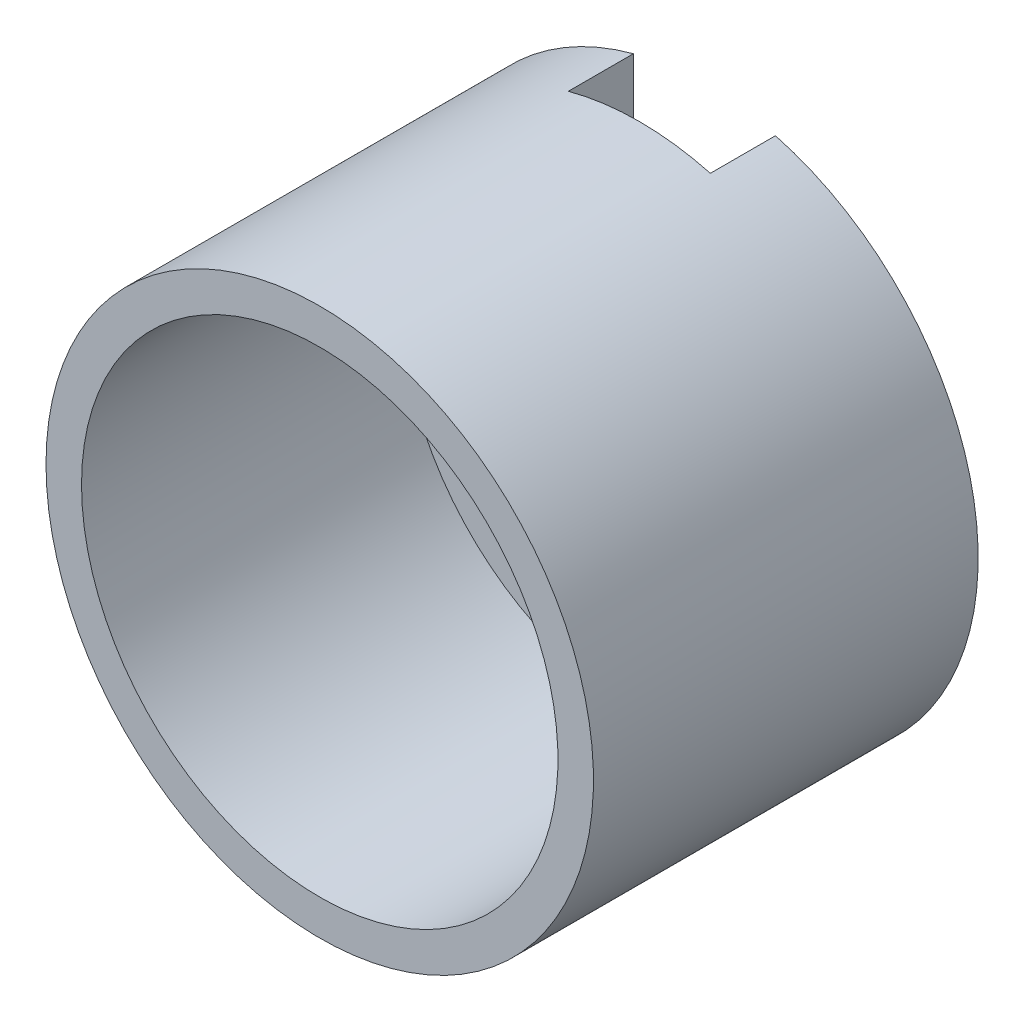
ISO-10303-21;
HEADER;
FILE_DESCRIPTION(('STEP AP214'),'2;1');
FILE_NAME('part.step','',(''),(''),'','','');
FILE_SCHEMA(('AUTOMOTIVE_DESIGN { 1 0 10303 214 1 1 1 1 }'));
ENDSEC;
DATA;
#1=APPLICATION_CONTEXT('core data for automotive mechanical design processes');
#2=APPLICATION_PROTOCOL_DEFINITION('international standard','automotive_design',2000,#1);
#3=PRODUCT_CONTEXT('',#1,'mechanical');
#4=PRODUCT('Part','Part','',(#3));
#5=PRODUCT_RELATED_PRODUCT_CATEGORY('part','',(#4));
#6=PRODUCT_DEFINITION_FORMATION('','',#4);
#7=PRODUCT_DEFINITION_CONTEXT('part definition',#1,'design');
#8=PRODUCT_DEFINITION('design','',#6,#7);
#9=PRODUCT_DEFINITION_SHAPE('','',#8);
#10=(LENGTH_UNIT() NAMED_UNIT(*) SI_UNIT(.MILLI.,.METRE.));
#11=(NAMED_UNIT(*) PLANE_ANGLE_UNIT() SI_UNIT($,.RADIAN.));
#12=(NAMED_UNIT(*) SI_UNIT($,.STERADIAN.) SOLID_ANGLE_UNIT());
#13=UNCERTAINTY_MEASURE_WITH_UNIT(LENGTH_MEASURE(1.E-05),#10,'distance_accuracy_value','');
#14=(GEOMETRIC_REPRESENTATION_CONTEXT(3) GLOBAL_UNCERTAINTY_ASSIGNED_CONTEXT((#13)) GLOBAL_UNIT_ASSIGNED_CONTEXT((#10,
#11,#12)) REPRESENTATION_CONTEXT('',''));
#15=CARTESIAN_POINT('',(0.,0.,0.));
#16=DIRECTION('',(0.,0.,1.));
#17=DIRECTION('',(1.,0.,0.));
#18=AXIS2_PLACEMENT_3D('',#15,#16,#17);
#19=CARTESIAN_POINT('',(0.,0.,2.2));
#20=DIRECTION('',(0.,0.,-1.));
#21=DIRECTION('',(-1.,0.,0.));
#22=AXIS2_PLACEMENT_3D('',#19,#20,#21);
#23=CYLINDRICAL_SURFACE('',#22,3.9);
#24=DIRECTION('',(0.,0.,-1.));
#25=VECTOR('',#24,1.);
#26=CARTESIAN_POINT('',(2.4,-3.074085229788,2.2));
#27=LINE('',#26,#25);
#28=CARTESIAN_POINT('',(2.4,-3.074085229788,2.2));
#29=VERTEX_POINT('',#28);
#30=CARTESIAN_POINT('',(2.4,-3.074085229788,0.));
#31=VERTEX_POINT('',#30);
#32=EDGE_CURVE('E122',#29,#31,#27,.T.);
#33=ORIENTED_EDGE('',*,*,#32,.F.);
#34=CARTESIAN_POINT('',(0.,0.,2.2));
#35=DIRECTION('',(0.,0.,1.));
#36=DIRECTION('',(-1.,0.,0.));
#37=AXIS2_PLACEMENT_3D('',#34,#35,#36);
#38=CIRCLE('',#37,3.9);
#39=CARTESIAN_POINT('',(2.4,3.074085229788,2.2));
#40=VERTEX_POINT('',#39);
#41=EDGE_CURVE('E11',#29,#40,#38,.T.);
#42=ORIENTED_EDGE('',*,*,#41,.T.);
#43=DIRECTION('',(0.,0.,-1.));
#44=VECTOR('',#43,1.);
#45=CARTESIAN_POINT('',(2.4,3.074085229788,2.2));
#46=LINE('',#45,#44);
#47=CARTESIAN_POINT('',(2.4,3.074085229788,0.));
#48=VERTEX_POINT('',#47);
#49=EDGE_CURVE('E140',#40,#48,#46,.T.);
#50=ORIENTED_EDGE('',*,*,#49,.T.);
#51=CARTESIAN_POINT('',(0.,0.,0.));
#52=DIRECTION('',(0.,0.,1.));
#53=DIRECTION('',(-1.,0.,0.));
#54=AXIS2_PLACEMENT_3D('',#51,#52,#53);
#55=CIRCLE('',#54,3.9);
#56=EDGE_CURVE('E134',#31,#48,#55,.T.);
#57=ORIENTED_EDGE('',*,*,#56,.F.);
#58=EDGE_LOOP('',(#33,#42,#50,#57));
#59=FACE_BOUND('',#58,.T.);
#60=ADVANCED_FACE('F17',(#59),#23,.F.);
#61=CARTESIAN_POINT('',(0.,0.,2.2));
#62=DIRECTION('',(0.,0.,1.));
#63=DIRECTION('',(0.,-1.,0.));
#64=AXIS2_PLACEMENT_3D('',#61,#62,#63);
#65=PLANE('',#64);
#66=DIRECTION('',(0.,1.,0.));
#67=VECTOR('',#66,1.);
#68=CARTESIAN_POINT('',(2.4,-10.,2.2));
#69=LINE('',#68,#67);
#70=CARTESIAN_POINT('',(2.4,-7.683911764199,2.2));
#71=VERTEX_POINT('',#70);
#72=EDGE_CURVE('E127',#71,#29,#69,.T.);
#73=ORIENTED_EDGE('',*,*,#72,.F.);
#74=CARTESIAN_POINT('',(0.,0.,2.2));
#75=DIRECTION('',(0.,0.,1.));
#76=DIRECTION('',(-1.,0.,0.));
#77=AXIS2_PLACEMENT_3D('',#74,#75,#76);
#78=CIRCLE('',#77,8.05);
#79=CARTESIAN_POINT('',(2.4,7.683911764199,2.2));
#80=VERTEX_POINT('',#79);
#81=EDGE_CURVE('E27',#71,#80,#78,.T.);
#82=ORIENTED_EDGE('',*,*,#81,.T.);
#83=DIRECTION('',(0.,1.,0.));
#84=VECTOR('',#83,1.);
#85=CARTESIAN_POINT('',(2.4,-10.,2.2));
#86=LINE('',#85,#84);
#87=EDGE_CURVE('E146',#40,#80,#86,.T.);
#88=ORIENTED_EDGE('',*,*,#87,.F.);
#89=ORIENTED_EDGE('',*,*,#41,.F.);
#90=EDGE_LOOP('',(#73,#82,#88,#89));
#91=FACE_BOUND('',#90,.T.);
#92=ADVANCED_FACE('F359',(#91),#65,.T.);
#93=CARTESIAN_POINT('',(0.,0.,13.));
#94=DIRECTION('',(0.,0.,-1.));
#95=DIRECTION('',(-1.,0.,0.));
#96=AXIS2_PLACEMENT_3D('',#93,#94,#95);
#97=CYLINDRICAL_SURFACE('',#96,8.05);
#98=DIRECTION('',(0.,0.,-1.));
#99=VECTOR('',#98,1.);
#100=CARTESIAN_POINT('',(-8.05,0.,13.));
#101=LINE('',#100,#99);
#102=CARTESIAN_POINT('',(-8.05,0.,13.));
#103=VERTEX_POINT('',#102);
#104=CARTESIAN_POINT('',(-8.05,0.,2.2));
#105=VERTEX_POINT('',#104);
#106=EDGE_CURVE('E158',#103,#105,#101,.T.);
#107=ORIENTED_EDGE('',*,*,#106,.F.);
#108=CARTESIAN_POINT('',(0.,0.,13.));
#109=DIRECTION('',(0.,0.,1.));
#110=DIRECTION('',(-1.,0.,0.));
#111=AXIS2_PLACEMENT_3D('',#108,#109,#110);
#112=CIRCLE('',#111,8.05);
#113=EDGE_CURVE('E210',#103,#103,#112,.T.);
#114=ORIENTED_EDGE('',*,*,#113,.T.);
#115=ORIENTED_EDGE('',*,*,#106,.T.);
#116=CARTESIAN_POINT('',(0.,0.,2.2));
#117=DIRECTION('',(0.,0.,1.));
#118=DIRECTION('',(-1.,0.,0.));
#119=AXIS2_PLACEMENT_3D('',#116,#117,#118);
#120=CIRCLE('',#119,8.05);
#121=CARTESIAN_POINT('',(-2.4,7.683911764199,2.2));
#122=VERTEX_POINT('',#121);
#123=EDGE_CURVE('E194',#122,#105,#120,.T.);
#124=ORIENTED_EDGE('',*,*,#123,.F.);
#125=CARTESIAN_POINT('',(0.,0.,2.2));
#126=DIRECTION('',(0.,0.,1.));
#127=DIRECTION('',(-1.,0.,0.));
#128=AXIS2_PLACEMENT_3D('',#125,#126,#127);
#129=CIRCLE('',#128,8.05);
#130=EDGE_CURVE('E204',#80,#122,#129,.T.);
#131=ORIENTED_EDGE('',*,*,#130,.F.);
#132=ORIENTED_EDGE('',*,*,#81,.F.);
#133=CARTESIAN_POINT('',(0.,0.,2.2));
#134=DIRECTION('',(0.,0.,1.));
#135=DIRECTION('',(-1.,0.,0.));
#136=AXIS2_PLACEMENT_3D('',#133,#134,#135);
#137=CIRCLE('',#136,8.05);
#138=CARTESIAN_POINT('',(-2.4,-7.683911764199,2.2));
#139=VERTEX_POINT('',#138);
#140=EDGE_CURVE('E135',#139,#71,#137,.T.);
#141=ORIENTED_EDGE('',*,*,#140,.F.);
#142=CARTESIAN_POINT('',(0.,0.,2.2));
#143=DIRECTION('',(0.,0.,1.));
#144=DIRECTION('',(-1.,0.,0.));
#145=AXIS2_PLACEMENT_3D('',#142,#143,#144);
#146=CIRCLE('',#145,8.05);
#147=EDGE_CURVE('E197',#105,#139,#146,.T.);
#148=ORIENTED_EDGE('',*,*,#147,.F.);
#149=EDGE_LOOP('',(#107,#114,#115,#124,#131,#132,#141,#148));
#150=FACE_BOUND('',#149,.T.);
#151=ADVANCED_FACE('F361',(#150),#97,.F.);
#152=CARTESIAN_POINT('',(0.,0.,2.2));
#153=DIRECTION('',(0.,0.,1.));
#154=DIRECTION('',(0.,-1.,0.));
#155=AXIS2_PLACEMENT_3D('',#152,#153,#154);
#156=PLANE('',#155);
#157=DIRECTION('',(0.,1.,0.));
#158=VECTOR('',#157,1.);
#159=CARTESIAN_POINT('',(2.4,-10.,2.2));
#160=LINE('',#159,#158);
#161=CARTESIAN_POINT('',(2.4,-8.933224501825,2.2));
#162=VERTEX_POINT('',#161);
#163=EDGE_CURVE('E143',#162,#71,#160,.T.);
#164=ORIENTED_EDGE('',*,*,#163,.F.);
#165=CARTESIAN_POINT('',(0.,0.,2.2));
#166=DIRECTION('',(0.,0.,1.));
#167=DIRECTION('',(-1.,0.,0.));
#168=AXIS2_PLACEMENT_3D('',#165,#166,#167);
#169=CIRCLE('',#168,9.25);
#170=CARTESIAN_POINT('',(-2.4,-8.933224501825,2.2));
#171=VERTEX_POINT('',#170);
#172=EDGE_CURVE('E244',#171,#162,#169,.T.);
#173=ORIENTED_EDGE('',*,*,#172,.F.);
#174=DIRECTION('',(0.,-1.,0.));
#175=VECTOR('',#174,1.);
#176=CARTESIAN_POINT('',(-2.4,10.,2.2));
#177=LINE('',#176,#175);
#178=EDGE_CURVE('E190',#139,#171,#177,.T.);
#179=ORIENTED_EDGE('',*,*,#178,.F.);
#180=ORIENTED_EDGE('',*,*,#140,.T.);
#181=EDGE_LOOP('',(#164,#173,#179,#180));
#182=FACE_BOUND('',#181,.T.);
#183=ADVANCED_FACE('F366',(#182),#156,.F.);
#184=CARTESIAN_POINT('',(2.4,-10.,0.));
#185=DIRECTION('',(-1.,0.,0.));
#186=DIRECTION('',(0.,0.,1.));
#187=AXIS2_PLACEMENT_3D('',#184,#185,#186);
#188=PLANE('',#187);
#189=DIRECTION('',(0.,1.,0.));
#190=VECTOR('',#189,1.);
#191=CARTESIAN_POINT('',(2.4,-10.,0.));
#192=LINE('',#191,#190);
#193=CARTESIAN_POINT('',(2.4,-8.933224501825,0.));
#194=VERTEX_POINT('',#193);
#195=EDGE_CURVE('E130',#194,#31,#192,.T.);
#196=ORIENTED_EDGE('',*,*,#195,.F.);
#197=DIRECTION('',(0.,0.,1.));
#198=VECTOR('',#197,1.);
#199=CARTESIAN_POINT('',(2.4,-8.933224501825,0.));
#200=LINE('',#199,#198);
#201=EDGE_CURVE('E239',#194,#162,#200,.T.);
#202=ORIENTED_EDGE('',*,*,#201,.T.);
#203=ORIENTED_EDGE('',*,*,#163,.T.);
#204=ORIENTED_EDGE('',*,*,#72,.T.);
#205=ORIENTED_EDGE('',*,*,#32,.T.);
#206=EDGE_LOOP('',(#196,#202,#203,#204,#205));
#207=FACE_BOUND('',#206,.T.);
#208=ADVANCED_FACE('F124',(#207),#188,.T.);
#209=CARTESIAN_POINT('',(0.,0.,0.));
#210=DIRECTION('',(0.,0.,1.));
#211=DIRECTION('',(0.,-1.,0.));
#212=AXIS2_PLACEMENT_3D('',#209,#210,#211);
#213=PLANE('',#212);
#214=ORIENTED_EDGE('',*,*,#195,.T.);
#215=ORIENTED_EDGE('',*,*,#56,.T.);
#216=DIRECTION('',(0.,1.,0.));
#217=VECTOR('',#216,1.);
#218=CARTESIAN_POINT('',(2.4,-10.,0.));
#219=LINE('',#218,#217);
#220=CARTESIAN_POINT('',(2.4,8.933224501825,0.));
#221=VERTEX_POINT('',#220);
#222=EDGE_CURVE('E209',#48,#221,#219,.T.);
#223=ORIENTED_EDGE('',*,*,#222,.T.);
#224=CARTESIAN_POINT('',(0.,0.,0.));
#225=DIRECTION('',(0.,0.,1.));
#226=DIRECTION('',(-1.,0.,0.));
#227=AXIS2_PLACEMENT_3D('',#224,#225,#226);
#228=CIRCLE('',#227,9.25);
#229=EDGE_CURVE('E144',#194,#221,#228,.T.);
#230=ORIENTED_EDGE('',*,*,#229,.F.);
#231=EDGE_LOOP('',(#214,#215,#223,#230));
#232=FACE_BOUND('',#231,.T.);
#233=ADVANCED_FACE('F141',(#232),#213,.F.);
#234=CARTESIAN_POINT('',(2.4,-10.,0.));
#235=DIRECTION('',(-1.,0.,0.));
#236=DIRECTION('',(0.,0.,1.));
#237=AXIS2_PLACEMENT_3D('',#234,#235,#236);
#238=PLANE('',#237);
#239=ORIENTED_EDGE('',*,*,#222,.F.);
#240=ORIENTED_EDGE('',*,*,#49,.F.);
#241=ORIENTED_EDGE('',*,*,#87,.T.);
#242=DIRECTION('',(0.,1.,0.));
#243=VECTOR('',#242,1.);
#244=CARTESIAN_POINT('',(2.4,-10.,2.2));
#245=LINE('',#244,#243);
#246=CARTESIAN_POINT('',(2.4,8.933224501825,2.2));
#247=VERTEX_POINT('',#246);
#248=EDGE_CURVE('E203',#80,#247,#245,.T.);
#249=ORIENTED_EDGE('',*,*,#248,.T.);
#250=DIRECTION('',(0.,0.,1.));
#251=VECTOR('',#250,1.);
#252=CARTESIAN_POINT('',(2.4,8.933224501825,0.));
#253=LINE('',#252,#251);
#254=EDGE_CURVE('E232',#221,#247,#253,.T.);
#255=ORIENTED_EDGE('',*,*,#254,.F.);
#256=EDGE_LOOP('',(#239,#240,#241,#249,#255));
#257=FACE_BOUND('',#256,.T.);
#258=ADVANCED_FACE('F235',(#257),#238,.T.);
#259=CARTESIAN_POINT('',(0.,0.,13.));
#260=DIRECTION('',(0.,0.,1.));
#261=DIRECTION('',(0.,-1.,0.));
#262=AXIS2_PLACEMENT_3D('',#259,#260,#261);
#263=PLANE('',#262);
#264=ORIENTED_EDGE('',*,*,#113,.F.);
#265=EDGE_LOOP('',(#264));
#266=FACE_BOUND('',#265,.T.);
#267=CARTESIAN_POINT('',(0.,0.,13.));
#268=DIRECTION('',(0.,0.,1.));
#269=DIRECTION('',(-1.,0.,0.));
#270=AXIS2_PLACEMENT_3D('',#267,#268,#269);
#271=CIRCLE('',#270,9.25);
#272=CARTESIAN_POINT('',(-9.25,0.,13.));
#273=VERTEX_POINT('',#272);
#274=EDGE_CURVE('E177',#273,#273,#271,.T.);
#275=ORIENTED_EDGE('',*,*,#274,.T.);
#276=EDGE_LOOP('',(#275));
#277=FACE_BOUND('',#276,.T.);
#278=ADVANCED_FACE('F331',(#266,#277),#263,.T.);
#279=CARTESIAN_POINT('',(0.,0.,2.2));
#280=DIRECTION('',(0.,0.,1.));
#281=DIRECTION('',(0.,-1.,0.));
#282=AXIS2_PLACEMENT_3D('',#279,#280,#281);
#283=PLANE('',#282);
#284=CARTESIAN_POINT('',(0.,0.,2.2));
#285=DIRECTION('',(0.,0.,1.));
#286=DIRECTION('',(-1.,0.,0.));
#287=AXIS2_PLACEMENT_3D('',#284,#285,#286);
#288=CIRCLE('',#287,9.25);
#289=CARTESIAN_POINT('',(-2.4,8.933224501825,2.2));
#290=VERTEX_POINT('',#289);
#291=EDGE_CURVE('E173',#247,#290,#288,.T.);
#292=ORIENTED_EDGE('',*,*,#291,.F.);
#293=ORIENTED_EDGE('',*,*,#248,.F.);
#294=ORIENTED_EDGE('',*,*,#130,.T.);
#295=DIRECTION('',(0.,-1.,0.));
#296=VECTOR('',#295,1.);
#297=CARTESIAN_POINT('',(-2.4,10.,2.2));
#298=LINE('',#297,#296);
#299=EDGE_CURVE('E261',#290,#122,#298,.T.);
#300=ORIENTED_EDGE('',*,*,#299,.F.);
#301=EDGE_LOOP('',(#292,#293,#294,#300));
#302=FACE_BOUND('',#301,.T.);
#303=ADVANCED_FACE('F353',(#302),#283,.F.);
#304=CARTESIAN_POINT('',(0.,0.,2.2));
#305=DIRECTION('',(0.,0.,1.));
#306=DIRECTION('',(0.,-1.,0.));
#307=AXIS2_PLACEMENT_3D('',#304,#305,#306);
#308=PLANE('',#307);
#309=ORIENTED_EDGE('',*,*,#123,.T.);
#310=ORIENTED_EDGE('',*,*,#147,.T.);
#311=DIRECTION('',(0.,-1.,0.));
#312=VECTOR('',#311,1.);
#313=CARTESIAN_POINT('',(-2.4,10.,2.2));
#314=LINE('',#313,#312);
#315=CARTESIAN_POINT('',(-2.4,-3.074085229788,2.2));
#316=VERTEX_POINT('',#315);
#317=EDGE_CURVE('E183',#316,#139,#314,.T.);
#318=ORIENTED_EDGE('',*,*,#317,.F.);
#319=CARTESIAN_POINT('',(0.,0.,2.2));
#320=DIRECTION('',(0.,0.,1.));
#321=DIRECTION('',(-1.,0.,0.));
#322=AXIS2_PLACEMENT_3D('',#319,#320,#321);
#323=CIRCLE('',#322,3.9);
#324=CARTESIAN_POINT('',(-3.9,0.,2.2));
#325=VERTEX_POINT('',#324);
#326=EDGE_CURVE('E189',#325,#316,#323,.T.);
#327=ORIENTED_EDGE('',*,*,#326,.F.);
#328=CARTESIAN_POINT('',(0.,0.,2.2));
#329=DIRECTION('',(0.,0.,1.));
#330=DIRECTION('',(-1.,0.,0.));
#331=AXIS2_PLACEMENT_3D('',#328,#329,#330);
#332=CIRCLE('',#331,3.9);
#333=CARTESIAN_POINT('',(-2.4,3.074085229788,2.2));
#334=VERTEX_POINT('',#333);
#335=EDGE_CURVE('E267',#334,#325,#332,.T.);
#336=ORIENTED_EDGE('',*,*,#335,.F.);
#337=DIRECTION('',(0.,-1.,0.));
#338=VECTOR('',#337,1.);
#339=CARTESIAN_POINT('',(-2.4,10.,2.2));
#340=LINE('',#339,#338);
#341=EDGE_CURVE('E258',#122,#334,#340,.T.);
#342=ORIENTED_EDGE('',*,*,#341,.F.);
#343=EDGE_LOOP('',(#309,#310,#318,#327,#336,#342));
#344=FACE_BOUND('',#343,.T.);
#345=ADVANCED_FACE('F345',(#344),#308,.T.);
#346=CARTESIAN_POINT('',(0.,0.,2.2));
#347=DIRECTION('',(0.,0.,-1.));
#348=DIRECTION('',(-1.,0.,0.));
#349=AXIS2_PLACEMENT_3D('',#346,#347,#348);
#350=CYLINDRICAL_SURFACE('',#349,3.9);
#351=DIRECTION('',(0.,0.,-1.));
#352=VECTOR('',#351,1.);
#353=CARTESIAN_POINT('',(-3.9,0.,2.2));
#354=LINE('',#353,#352);
#355=CARTESIAN_POINT('',(-3.9,0.,0.));
#356=VERTEX_POINT('',#355);
#357=EDGE_CURVE('E266',#325,#356,#354,.T.);
#358=ORIENTED_EDGE('',*,*,#357,.F.);
#359=ORIENTED_EDGE('',*,*,#326,.T.);
#360=DIRECTION('',(0.,0.,-1.));
#361=VECTOR('',#360,1.);
#362=CARTESIAN_POINT('',(-2.4,-3.074085229788,2.2));
#363=LINE('',#362,#361);
#364=CARTESIAN_POINT('',(-2.4,-3.074085229788,0.));
#365=VERTEX_POINT('',#364);
#366=EDGE_CURVE('E176',#316,#365,#363,.T.);
#367=ORIENTED_EDGE('',*,*,#366,.T.);
#368=CARTESIAN_POINT('',(0.,0.,0.));
#369=DIRECTION('',(0.,0.,1.));
#370=DIRECTION('',(-1.,0.,0.));
#371=AXIS2_PLACEMENT_3D('',#368,#369,#370);
#372=CIRCLE('',#371,3.9);
#373=EDGE_CURVE('E293',#356,#365,#372,.T.);
#374=ORIENTED_EDGE('',*,*,#373,.F.);
#375=EDGE_LOOP('',(#358,#359,#367,#374));
#376=FACE_BOUND('',#375,.T.);
#377=ADVANCED_FACE('F341',(#376),#350,.F.);
#378=CARTESIAN_POINT('',(-2.4,10.,0.));
#379=DIRECTION('',(1.,0.,0.));
#380=DIRECTION('',(0.,1.,0.));
#381=AXIS2_PLACEMENT_3D('',#378,#379,#380);
#382=PLANE('',#381);
#383=DIRECTION('',(0.,-1.,0.));
#384=VECTOR('',#383,1.);
#385=CARTESIAN_POINT('',(-2.4,10.,0.));
#386=LINE('',#385,#384);
#387=CARTESIAN_POINT('',(-2.4,-8.933224501825,0.));
#388=VERTEX_POINT('',#387);
#389=EDGE_CURVE('E286',#365,#388,#386,.T.);
#390=ORIENTED_EDGE('',*,*,#389,.F.);
#391=ORIENTED_EDGE('',*,*,#366,.F.);
#392=ORIENTED_EDGE('',*,*,#317,.T.);
#393=ORIENTED_EDGE('',*,*,#178,.T.);
#394=DIRECTION('',(0.,0.,1.));
#395=VECTOR('',#394,1.);
#396=CARTESIAN_POINT('',(-2.4,-8.933224501825,0.));
#397=LINE('',#396,#395);
#398=EDGE_CURVE('E249',#388,#171,#397,.T.);
#399=ORIENTED_EDGE('',*,*,#398,.F.);
#400=EDGE_LOOP('',(#390,#391,#392,#393,#399));
#401=FACE_BOUND('',#400,.T.);
#402=ADVANCED_FACE('F316',(#401),#382,.T.);
#403=CARTESIAN_POINT('',(0.,0.,0.));
#404=DIRECTION('',(0.,0.,1.));
#405=DIRECTION('',(-1.,0.,0.));
#406=AXIS2_PLACEMENT_3D('',#403,#404,#405);
#407=CYLINDRICAL_SURFACE('',#406,9.25);
#408=DIRECTION('',(0.,0.,1.));
#409=VECTOR('',#408,1.);
#410=CARTESIAN_POINT('',(-9.25,0.,0.));
#411=LINE('',#410,#409);
#412=CARTESIAN_POINT('',(-9.25,0.,0.));
#413=VERTEX_POINT('',#412);
#414=EDGE_CURVE('E252',#413,#273,#411,.T.);
#415=ORIENTED_EDGE('',*,*,#414,.F.);
#416=CARTESIAN_POINT('',(0.,0.,0.));
#417=DIRECTION('',(0.,0.,1.));
#418=DIRECTION('',(-1.,0.,0.));
#419=AXIS2_PLACEMENT_3D('',#416,#417,#418);
#420=CIRCLE('',#419,9.25);
#421=EDGE_CURVE('E284',#413,#388,#420,.T.);
#422=ORIENTED_EDGE('',*,*,#421,.T.);
#423=ORIENTED_EDGE('',*,*,#398,.T.);
#424=ORIENTED_EDGE('',*,*,#172,.T.);
#425=ORIENTED_EDGE('',*,*,#201,.F.);
#426=ORIENTED_EDGE('',*,*,#229,.T.);
#427=ORIENTED_EDGE('',*,*,#254,.T.);
#428=ORIENTED_EDGE('',*,*,#291,.T.);
#429=DIRECTION('',(0.,0.,1.));
#430=VECTOR('',#429,1.);
#431=CARTESIAN_POINT('',(-2.4,8.933224501825,0.));
#432=LINE('',#431,#430);
#433=CARTESIAN_POINT('',(-2.4,8.933224501825,0.));
#434=VERTEX_POINT('',#433);
#435=EDGE_CURVE('E260',#434,#290,#432,.T.);
#436=ORIENTED_EDGE('',*,*,#435,.F.);
#437=CARTESIAN_POINT('',(0.,0.,0.));
#438=DIRECTION('',(0.,0.,1.));
#439=DIRECTION('',(-1.,0.,0.));
#440=AXIS2_PLACEMENT_3D('',#437,#438,#439);
#441=CIRCLE('',#440,9.25);
#442=EDGE_CURVE('E276',#434,#413,#441,.T.);
#443=ORIENTED_EDGE('',*,*,#442,.T.);
#444=ORIENTED_EDGE('',*,*,#414,.T.);
#445=ORIENTED_EDGE('',*,*,#274,.F.);
#446=EDGE_LOOP('',(#415,#422,#423,#424,#425,#426,#427,#428,#436,#443,#444,#445));
#447=FACE_BOUND('',#446,.T.);
#448=ADVANCED_FACE('F238',(#447),#407,.T.);
#449=CARTESIAN_POINT('',(-2.4,10.,0.));
#450=DIRECTION('',(1.,0.,0.));
#451=DIRECTION('',(0.,1.,0.));
#452=AXIS2_PLACEMENT_3D('',#449,#450,#451);
#453=PLANE('',#452);
#454=DIRECTION('',(0.,-1.,0.));
#455=VECTOR('',#454,1.);
#456=CARTESIAN_POINT('',(-2.4,10.,0.));
#457=LINE('',#456,#455);
#458=CARTESIAN_POINT('',(-2.4,3.074085229788,0.));
#459=VERTEX_POINT('',#458);
#460=EDGE_CURVE('E272',#434,#459,#457,.T.);
#461=ORIENTED_EDGE('',*,*,#460,.F.);
#462=ORIENTED_EDGE('',*,*,#435,.T.);
#463=ORIENTED_EDGE('',*,*,#299,.T.);
#464=ORIENTED_EDGE('',*,*,#341,.T.);
#465=DIRECTION('',(0.,0.,-1.));
#466=VECTOR('',#465,1.);
#467=CARTESIAN_POINT('',(-2.4,3.074085229788,2.2));
#468=LINE('',#467,#466);
#469=EDGE_CURVE('E265',#334,#459,#468,.T.);
#470=ORIENTED_EDGE('',*,*,#469,.T.);
#471=EDGE_LOOP('',(#461,#462,#463,#464,#470));
#472=FACE_BOUND('',#471,.T.);
#473=ADVANCED_FACE('F391',(#472),#453,.T.);
#474=CARTESIAN_POINT('',(0.,0.,2.2));
#475=DIRECTION('',(0.,0.,-1.));
#476=DIRECTION('',(-1.,0.,0.));
#477=AXIS2_PLACEMENT_3D('',#474,#475,#476);
#478=CYLINDRICAL_SURFACE('',#477,3.9);
#479=ORIENTED_EDGE('',*,*,#335,.T.);
#480=ORIENTED_EDGE('',*,*,#357,.T.);
#481=CARTESIAN_POINT('',(0.,0.,0.));
#482=DIRECTION('',(0.,0.,1.));
#483=DIRECTION('',(-1.,0.,0.));
#484=AXIS2_PLACEMENT_3D('',#481,#482,#483);
#485=CIRCLE('',#484,3.9);
#486=EDGE_CURVE('E299',#459,#356,#485,.T.);
#487=ORIENTED_EDGE('',*,*,#486,.F.);
#488=ORIENTED_EDGE('',*,*,#469,.F.);
#489=EDGE_LOOP('',(#479,#480,#487,#488));
#490=FACE_BOUND('',#489,.T.);
#491=ADVANCED_FACE('F339',(#490),#478,.F.);
#492=CARTESIAN_POINT('',(0.,0.,0.));
#493=DIRECTION('',(0.,0.,1.));
#494=DIRECTION('',(0.,-1.,0.));
#495=AXIS2_PLACEMENT_3D('',#492,#493,#494);
#496=PLANE('',#495);
#497=ORIENTED_EDGE('',*,*,#486,.T.);
#498=ORIENTED_EDGE('',*,*,#373,.T.);
#499=ORIENTED_EDGE('',*,*,#389,.T.);
#500=ORIENTED_EDGE('',*,*,#421,.F.);
#501=ORIENTED_EDGE('',*,*,#442,.F.);
#502=ORIENTED_EDGE('',*,*,#460,.T.);
#503=EDGE_LOOP('',(#497,#498,#499,#500,#501,#502));
#504=FACE_BOUND('',#503,.T.);
#505=ADVANCED_FACE('F315',(#504),#496,.F.);
#506=CLOSED_SHELL('',(#60,#92,#151,#183,#208,#233,#258,#278,#303,#345,#377,#402,#448,#473,#491,#505));
#507=MANIFOLD_SOLID_BREP('B1',#506);
#508=ADVANCED_BREP_SHAPE_REPRESENTATION('',(#18,#507),#14);
#509=SHAPE_DEFINITION_REPRESENTATION(#9,#508);
ENDSEC;
END-ISO-10303-21;
